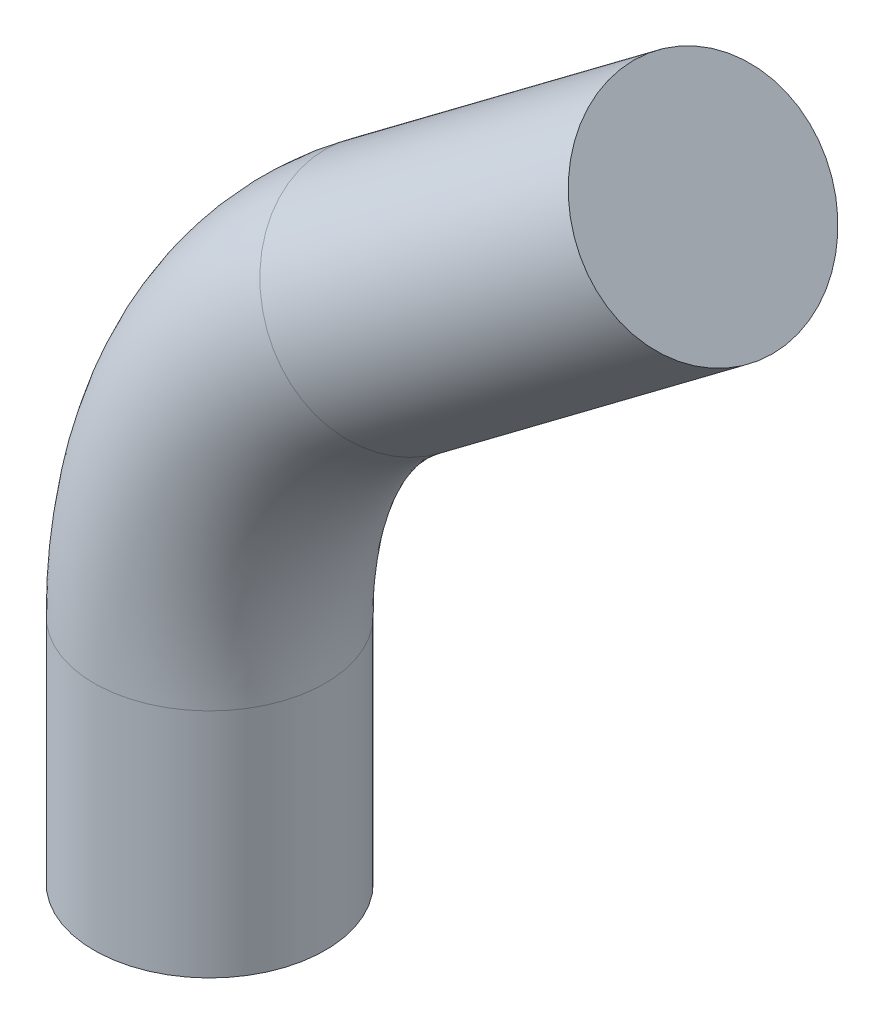
ISO-10303-21;
HEADER;
FILE_DESCRIPTION(('STEP AP214'),'2;1');
FILE_NAME('part.step','',(''),(''),'','','');
FILE_SCHEMA(('AUTOMOTIVE_DESIGN { 1 0 10303 214 1 1 1 1 }'));
ENDSEC;
DATA;
#1=APPLICATION_CONTEXT('core data for automotive mechanical design processes');
#2=APPLICATION_PROTOCOL_DEFINITION('international standard','automotive_design',2000,#1);
#3=PRODUCT_CONTEXT('',#1,'mechanical');
#4=PRODUCT('Part','Part','',(#3));
#5=PRODUCT_RELATED_PRODUCT_CATEGORY('part','',(#4));
#6=PRODUCT_DEFINITION_FORMATION('','',#4);
#7=PRODUCT_DEFINITION_CONTEXT('part definition',#1,'design');
#8=PRODUCT_DEFINITION('design','',#6,#7);
#9=PRODUCT_DEFINITION_SHAPE('','',#8);
#10=(LENGTH_UNIT() NAMED_UNIT(*) SI_UNIT(.MILLI.,.METRE.));
#11=(NAMED_UNIT(*) PLANE_ANGLE_UNIT() SI_UNIT($,.RADIAN.));
#12=(NAMED_UNIT(*) SI_UNIT($,.STERADIAN.) SOLID_ANGLE_UNIT());
#13=UNCERTAINTY_MEASURE_WITH_UNIT(LENGTH_MEASURE(1.E-05),#10,'distance_accuracy_value','');
#14=(GEOMETRIC_REPRESENTATION_CONTEXT(3) GLOBAL_UNCERTAINTY_ASSIGNED_CONTEXT((#13)) GLOBAL_UNIT_ASSIGNED_CONTEXT((#10,
#11,#12)) REPRESENTATION_CONTEXT('',''));
#15=CARTESIAN_POINT('',(0.,0.,0.));
#16=DIRECTION('',(0.,0.,1.));
#17=DIRECTION('',(1.,0.,0.));
#18=AXIS2_PLACEMENT_3D('',#15,#16,#17);
#19=CARTESIAN_POINT('',(0.,-30.,0.));
#20=DIRECTION('',(0.,-1.,0.));
#21=DIRECTION('',(1.,0.,0.));
#22=AXIS2_PLACEMENT_3D('',#19,#20,#21);
#23=PLANE('',#22);
#24=CARTESIAN_POINT('',(0.,-30.,0.));
#25=DIRECTION('',(0.,-1.,0.));
#26=DIRECTION('',(1.,0.,0.));
#27=AXIS2_PLACEMENT_3D('',#24,#25,#26);
#28=CIRCLE('',#27,7.5);
#29=CARTESIAN_POINT('',(-7.5,-30.,0.));
#30=VERTEX_POINT('',#29);
#31=EDGE_CURVE('E61',#30,#30,#28,.T.);
#32=ORIENTED_EDGE('',*,*,#31,.T.);
#33=EDGE_LOOP('',(#32));
#34=FACE_BOUND('',#33,.T.);
#35=ADVANCED_FACE('F47',(#34),#23,.T.);
#36=CARTESIAN_POINT('',(32.,24.,0.));
#37=DIRECTION('',(-0.8,-0.6,0.));
#38=DIRECTION('',(0.6,-0.8,0.));
#39=AXIS2_PLACEMENT_3D('',#36,#37,#38);
#40=PLANE('',#39);
#41=CARTESIAN_POINT('',(32.,24.,0.));
#42=DIRECTION('',(-0.8,-0.6,0.));
#43=DIRECTION('',(0.6,-0.8,0.));
#44=AXIS2_PLACEMENT_3D('',#41,#42,#43);
#45=CIRCLE('',#44,7.5);
#46=CARTESIAN_POINT('',(36.5,18.,0.));
#47=VERTEX_POINT('',#46);
#48=EDGE_CURVE('E11',#47,#47,#45,.T.);
#49=ORIENTED_EDGE('',*,*,#48,.F.);
#50=EDGE_LOOP('',(#49));
#51=FACE_BOUND('',#50,.T.);
#52=ADVANCED_FACE('F71',(#51),#40,.F.);
#53=CARTESIAN_POINT('',(0.,-30.,0.));
#54=DIRECTION('',(0.,1.,0.));
#55=DIRECTION('',(-1.,0.,0.));
#56=AXIS2_PLACEMENT_3D('',#53,#54,#55);
#57=CYLINDRICAL_SURFACE('',#56,7.5);
#58=CARTESIAN_POINT('',(0.,-15.,0.));
#59=DIRECTION('',(0.,-1.,0.));
#60=DIRECTION('',(1.,0.,0.));
#61=AXIS2_PLACEMENT_3D('',#58,#59,#60);
#62=CIRCLE('',#61,7.5);
#63=CARTESIAN_POINT('',(-7.5,-15.,0.));
#64=VERTEX_POINT('',#63);
#65=EDGE_CURVE('E57',#64,#64,#62,.T.);
#66=CARTESIAN_POINT('',(-7.5,-15.,0.));
#67=CARTESIAN_POINT('',(-7.5,-15.15625,0.));
#68=CARTESIAN_POINT('',(-7.5,-15.3125,0.));
#69=CARTESIAN_POINT('',(-7.5,-15.625,0.));
#70=CARTESIAN_POINT('',(-7.5,-15.78125,0.));
#71=CARTESIAN_POINT('',(-7.5,-16.09375,0.));
#72=CARTESIAN_POINT('',(-7.5,-16.25,0.));
#73=CARTESIAN_POINT('',(-7.5,-16.5625,0.));
#74=CARTESIAN_POINT('',(-7.5,-16.71875,0.));
#75=CARTESIAN_POINT('',(-7.5,-17.03125,0.));
#76=CARTESIAN_POINT('',(-7.5,-17.1875,0.));
#77=CARTESIAN_POINT('',(-7.5,-17.5,0.));
#78=CARTESIAN_POINT('',(-7.5,-17.65625,0.));
#79=CARTESIAN_POINT('',(-7.5,-17.96875,0.));
#80=CARTESIAN_POINT('',(-7.5,-18.125,0.));
#81=CARTESIAN_POINT('',(-7.5,-18.4375,0.));
#82=CARTESIAN_POINT('',(-7.5,-18.59375,0.));
#83=CARTESIAN_POINT('',(-7.5,-18.90625,0.));
#84=CARTESIAN_POINT('',(-7.5,-19.0625,0.));
#85=CARTESIAN_POINT('',(-7.5,-19.375,0.));
#86=CARTESIAN_POINT('',(-7.5,-19.53125,0.));
#87=CARTESIAN_POINT('',(-7.5,-19.84375,0.));
#88=CARTESIAN_POINT('',(-7.5,-20.,0.));
#89=CARTESIAN_POINT('',(-7.5,-20.3125,0.));
#90=CARTESIAN_POINT('',(-7.5,-20.46875,0.));
#91=CARTESIAN_POINT('',(-7.5,-20.78125,0.));
#92=CARTESIAN_POINT('',(-7.5,-20.9375,0.));
#93=CARTESIAN_POINT('',(-7.5,-21.25,0.));
#94=CARTESIAN_POINT('',(-7.5,-21.40625,0.));
#95=CARTESIAN_POINT('',(-7.5,-21.71875,0.));
#96=CARTESIAN_POINT('',(-7.5,-21.875,0.));
#97=CARTESIAN_POINT('',(-7.5,-22.1875,0.));
#98=CARTESIAN_POINT('',(-7.5,-22.34375,0.));
#99=CARTESIAN_POINT('',(-7.5,-22.65625,0.));
#100=CARTESIAN_POINT('',(-7.5,-22.8125,0.));
#101=CARTESIAN_POINT('',(-7.5,-23.125,0.));
#102=CARTESIAN_POINT('',(-7.5,-23.28125,0.));
#103=CARTESIAN_POINT('',(-7.5,-23.59375,0.));
#104=CARTESIAN_POINT('',(-7.5,-23.75,0.));
#105=CARTESIAN_POINT('',(-7.5,-24.0625,0.));
#106=CARTESIAN_POINT('',(-7.5,-24.21875,0.));
#107=CARTESIAN_POINT('',(-7.5,-24.53125,0.));
#108=CARTESIAN_POINT('',(-7.5,-24.6875,0.));
#109=CARTESIAN_POINT('',(-7.5,-25.,0.));
#110=CARTESIAN_POINT('',(-7.5,-25.15625,0.));
#111=CARTESIAN_POINT('',(-7.5,-25.46875,0.));
#112=CARTESIAN_POINT('',(-7.5,-25.625,0.));
#113=CARTESIAN_POINT('',(-7.5,-25.9375,0.));
#114=CARTESIAN_POINT('',(-7.5,-26.09375,0.));
#115=CARTESIAN_POINT('',(-7.5,-26.40625,0.));
#116=CARTESIAN_POINT('',(-7.5,-26.5625,0.));
#117=CARTESIAN_POINT('',(-7.5,-26.875,0.));
#118=CARTESIAN_POINT('',(-7.5,-27.03125,0.));
#119=CARTESIAN_POINT('',(-7.5,-27.34375,0.));
#120=CARTESIAN_POINT('',(-7.5,-27.5,0.));
#121=CARTESIAN_POINT('',(-7.5,-27.8125,0.));
#122=CARTESIAN_POINT('',(-7.5,-27.96875,0.));
#123=CARTESIAN_POINT('',(-7.5,-28.28125,0.));
#124=CARTESIAN_POINT('',(-7.5,-28.4375,0.));
#125=CARTESIAN_POINT('',(-7.5,-28.75,0.));
#126=CARTESIAN_POINT('',(-7.5,-28.90625,0.));
#127=CARTESIAN_POINT('',(-7.5,-29.21875,0.));
#128=CARTESIAN_POINT('',(-7.5,-29.375,0.));
#129=CARTESIAN_POINT('',(-7.5,-29.6875,0.));
#130=CARTESIAN_POINT('',(-7.5,-29.84375,0.));
#131=CARTESIAN_POINT('',(-7.5,-30.,0.));
#132=B_SPLINE_CURVE_WITH_KNOTS('',3,(#66,#67,#68,#69,#70,#71,#72,#73,#74,#75,#76,#77,#78,#79,
#80,#81,#82,#83,#84,#85,#86,#87,#88,#89,#90,#91,#92,#93,#94,#95,#96,#97,#98,#99,#100,#101,#102,
#103,#104,#105,#106,#107,#108,#109,#110,#111,#112,#113,#114,#115,#116,#117,#118,#119,#120,#121,
#122,#123,#124,#125,#126,#127,#128,#129,#130,#131),.UNSPECIFIED.,.F.,.F.,(4,2,2,2,2,2,2,2,2,2,2,
2,2,2,2,2,2,2,2,2,2,2,2,2,2,2,2,2,2,2,2,2,4),(0.,0.46875,0.937500000000001,1.40625,1.875,
2.34375,2.8125,3.28125,3.75,4.21875,4.6875,5.15625,5.625,6.09375,6.5625,7.03125,7.5,7.96875,
8.4375,8.90625,9.37500000000001,9.84375,10.3125,10.78125,11.25,11.71875,12.1875,12.65625,13.125,
13.59375,14.0625,14.53125,15.),.UNSPECIFIED.);
#133=EDGE_CURVE('BSEAM68',#64,#30,#132,.T.);
#134=ORIENTED_EDGE('',*,*,#65,.T.);
#135=ORIENTED_EDGE('',*,*,#31,.F.);
#136=ORIENTED_EDGE('',*,*,#133,.T.);
#137=ORIENTED_EDGE('',*,*,#133,.F.);
#138=EDGE_LOOP('',(#134,#136,#135,#137));
#139=FACE_BOUND('',#138,.T.);
#140=ADVANCED_FACE('F68',(#139),#57,.T.);
#141=CARTESIAN_POINT('',(30.,-15.,0.));
#142=DIRECTION('',(0.,0.,-1.));
#143=DIRECTION('',(-1.,0.,0.));
#144=AXIS2_PLACEMENT_3D('',#141,#142,#143);
#145=TOROIDAL_SURFACE('',#144,30.,7.5);
#146=CARTESIAN_POINT('',(12.,9.00000000000001,0.));
#147=DIRECTION('',(-0.8,-0.6,0.));
#148=DIRECTION('',(0.6,-0.8,0.));
#149=AXIS2_PLACEMENT_3D('',#146,#147,#148);
#150=CIRCLE('',#149,7.5);
#151=CARTESIAN_POINT('',(7.50000000000001,15.,0.));
#152=VERTEX_POINT('',#151);
#153=EDGE_CURVE('E53',#152,#152,#150,.T.);
#154=CARTESIAN_POINT('',(30.,-15.,0.));
#155=DIRECTION('',(0.,0.,-1.));
#156=DIRECTION('',(-1.,0.,0.));
#157=AXIS2_PLACEMENT_3D('',#154,#155,#156);
#158=CIRCLE('',#157,37.5);
#159=EDGE_CURVE('',#64,#152,#158,.T.);
#160=ORIENTED_EDGE('',*,*,#65,.F.);
#161=ORIENTED_EDGE('',*,*,#153,.T.);
#162=ORIENTED_EDGE('',*,*,#159,.T.);
#163=ORIENTED_EDGE('',*,*,#159,.F.);
#164=EDGE_LOOP('',(#160,#162,#161,#163));
#165=FACE_BOUND('',#164,.T.);
#166=ADVANCED_FACE('F70',(#165),#145,.T.);
#167=CARTESIAN_POINT('',(12.,9.00000000000001,0.));
#168=DIRECTION('',(0.8,0.6,0.));
#169=DIRECTION('',(-0.6,0.8,0.));
#170=AXIS2_PLACEMENT_3D('',#167,#168,#169);
#171=CYLINDRICAL_SURFACE('',#170,7.5);
#172=ORIENTED_EDGE('',*,*,#48,.T.);
#173=EDGE_LOOP('',(#172));
#174=FACE_BOUND('',#173,.T.);
#175=ORIENTED_EDGE('',*,*,#153,.F.);
#176=EDGE_LOOP('',(#175));
#177=FACE_BOUND('',#176,.T.);
#178=ADVANCED_FACE('F78',(#174,#177),#171,.T.);
#179=CLOSED_SHELL('',(#35,#52,#140,#166,#178));
#180=MANIFOLD_SOLID_BREP('B2',#179);
#181=ADVANCED_BREP_SHAPE_REPRESENTATION('',(#18,#180),#14);
#182=SHAPE_DEFINITION_REPRESENTATION(#9,#181);
ENDSEC;
END-ISO-10303-21;
